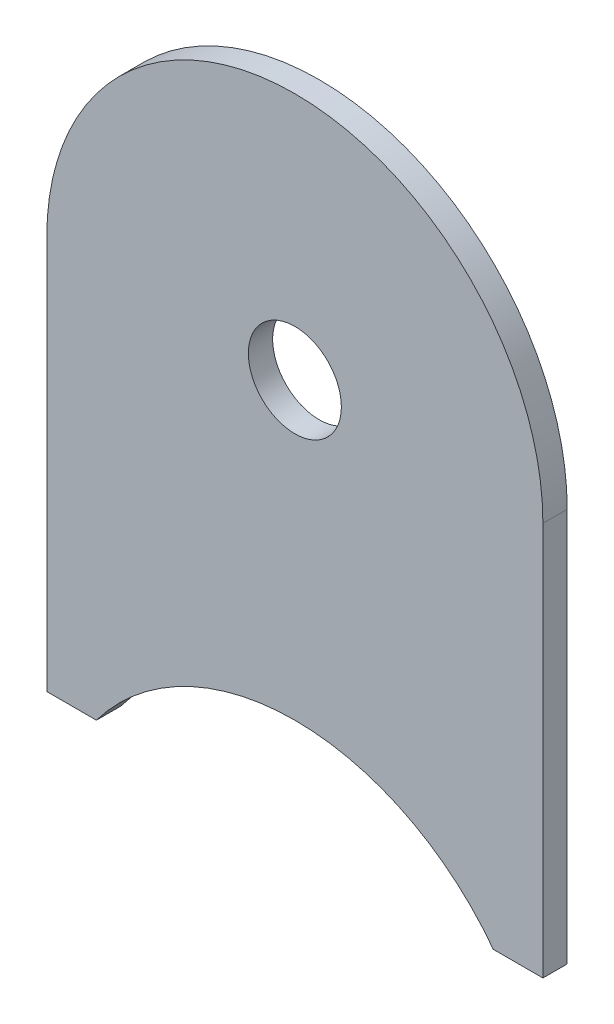
ISO-10303-21;
HEADER;
FILE_DESCRIPTION(('STEP AP214'),'2;1');
FILE_NAME('part.step','',(''),(''),'','','');
FILE_SCHEMA(('AUTOMOTIVE_DESIGN { 1 0 10303 214 1 1 1 1 }'));
ENDSEC;
DATA;
#1=APPLICATION_CONTEXT('core data for automotive mechanical design processes');
#2=APPLICATION_PROTOCOL_DEFINITION('international standard','automotive_design',2000,#1);
#3=PRODUCT_CONTEXT('',#1,'mechanical');
#4=PRODUCT('Part','Part','',(#3));
#5=PRODUCT_RELATED_PRODUCT_CATEGORY('part','',(#4));
#6=PRODUCT_DEFINITION_FORMATION('','',#4);
#7=PRODUCT_DEFINITION_CONTEXT('part definition',#1,'design');
#8=PRODUCT_DEFINITION('design','',#6,#7);
#9=PRODUCT_DEFINITION_SHAPE('','',#8);
#10=(LENGTH_UNIT() NAMED_UNIT(*) SI_UNIT(.MILLI.,.METRE.));
#11=(NAMED_UNIT(*) PLANE_ANGLE_UNIT() SI_UNIT($,.RADIAN.));
#12=(NAMED_UNIT(*) SI_UNIT($,.STERADIAN.) SOLID_ANGLE_UNIT());
#13=UNCERTAINTY_MEASURE_WITH_UNIT(LENGTH_MEASURE(1.E-05),#10,'distance_accuracy_value','');
#14=(GEOMETRIC_REPRESENTATION_CONTEXT(3) GLOBAL_UNCERTAINTY_ASSIGNED_CONTEXT((#13)) GLOBAL_UNIT_ASSIGNED_CONTEXT((#10,
#11,#12)) REPRESENTATION_CONTEXT('',''));
#15=CARTESIAN_POINT('',(0.,0.,0.));
#16=DIRECTION('',(0.,0.,1.));
#17=DIRECTION('',(1.,0.,0.));
#18=AXIS2_PLACEMENT_3D('',#15,#16,#17);
#19=CARTESIAN_POINT('',(12.7,20.16125,1.2446));
#20=DIRECTION('',(0.,0.,-1.));
#21=DIRECTION('',(-1.,0.,0.));
#22=AXIS2_PLACEMENT_3D('',#19,#20,#21);
#23=PLANE('',#22);
#24=DIRECTION('',(0.,-1.,0.));
#25=VECTOR('',#24,1.);
#26=CARTESIAN_POINT('',(0.,0.,1.2446));
#27=LINE('',#26,#25);
#28=CARTESIAN_POINT('',(0.,20.16125,1.2446));
#29=VERTEX_POINT('',#28);
#30=CARTESIAN_POINT('',(0.,0.,1.2446));
#31=VERTEX_POINT('',#30);
#32=EDGE_CURVE('E152',#29,#31,#27,.T.);
#33=ORIENTED_EDGE('',*,*,#32,.T.);
#34=DIRECTION('',(1.,0.,0.));
#35=VECTOR('',#34,1.);
#36=CARTESIAN_POINT('',(0.,0.,1.2446));
#37=LINE('',#36,#35);
#38=CARTESIAN_POINT('',(2.53999999999999,0.,1.2446));
#39=VERTEX_POINT('',#38);
#40=EDGE_CURVE('E100',#31,#39,#37,.T.);
#41=ORIENTED_EDGE('',*,*,#40,.T.);
#42=CARTESIAN_POINT('',(12.7,-7.62,1.2446));
#43=DIRECTION('',(0.,0.,-1.));
#44=DIRECTION('',(1.,0.,0.));
#45=AXIS2_PLACEMENT_3D('',#42,#43,#44);
#46=CIRCLE('',#45,12.7);
#47=CARTESIAN_POINT('',(22.86,0.,1.2446));
#48=VERTEX_POINT('',#47);
#49=EDGE_CURVE('E113',#39,#48,#46,.T.);
#50=ORIENTED_EDGE('',*,*,#49,.T.);
#51=DIRECTION('',(1.,0.,0.));
#52=VECTOR('',#51,1.);
#53=CARTESIAN_POINT('',(22.86,0.,1.2446));
#54=LINE('',#53,#52);
#55=CARTESIAN_POINT('',(25.4,0.,1.2446));
#56=VERTEX_POINT('',#55);
#57=EDGE_CURVE('E107',#48,#56,#54,.T.);
#58=ORIENTED_EDGE('',*,*,#57,.T.);
#59=DIRECTION('',(0.,1.,0.));
#60=VECTOR('',#59,1.);
#61=CARTESIAN_POINT('',(25.4,0.,1.2446));
#62=LINE('',#61,#60);
#63=CARTESIAN_POINT('',(25.4,20.16125,1.2446));
#64=VERTEX_POINT('',#63);
#65=EDGE_CURVE('E111',#56,#64,#62,.T.);
#66=ORIENTED_EDGE('',*,*,#65,.T.);
#67=CARTESIAN_POINT('',(12.7,20.16125,1.2446));
#68=DIRECTION('',(0.,0.,1.));
#69=DIRECTION('',(-1.,0.,0.));
#70=AXIS2_PLACEMENT_3D('',#67,#68,#69);
#71=CIRCLE('',#70,12.7);
#72=EDGE_CURVE('E63',#64,#29,#71,.T.);
#73=ORIENTED_EDGE('',*,*,#72,.T.);
#74=EDGE_LOOP('',(#33,#41,#50,#58,#66,#73));
#75=FACE_BOUND('',#74,.T.);
#76=CARTESIAN_POINT('',(12.7,20.16125,1.2446));
#77=DIRECTION('',(0.,0.,1.));
#78=DIRECTION('',(1.,0.,0.));
#79=AXIS2_PLACEMENT_3D('',#76,#77,#78);
#80=CIRCLE('',#79,2.38125);
#81=CARTESIAN_POINT('',(15.08125,20.16125,1.2446));
#82=VERTEX_POINT('',#81);
#83=EDGE_CURVE('E140',#82,#82,#80,.T.);
#84=ORIENTED_EDGE('',*,*,#83,.F.);
#85=EDGE_LOOP('',(#84));
#86=FACE_BOUND('',#85,.T.);
#87=ADVANCED_FACE('F45',(#75,#86),#23,.F.);
#88=CARTESIAN_POINT('',(12.7,20.16125,0.));
#89=DIRECTION('',(0.,0.,-1.));
#90=DIRECTION('',(-1.,0.,0.));
#91=AXIS2_PLACEMENT_3D('',#88,#89,#90);
#92=PLANE('',#91);
#93=DIRECTION('',(0.,-1.,0.));
#94=VECTOR('',#93,1.);
#95=CARTESIAN_POINT('',(0.,0.,0.));
#96=LINE('',#95,#94);
#97=CARTESIAN_POINT('',(0.,20.16125,0.));
#98=VERTEX_POINT('',#97);
#99=CARTESIAN_POINT('',(0.,0.,0.));
#100=VERTEX_POINT('',#99);
#101=EDGE_CURVE('E135',#98,#100,#96,.T.);
#102=ORIENTED_EDGE('',*,*,#101,.F.);
#103=CARTESIAN_POINT('',(12.7,20.16125,0.));
#104=DIRECTION('',(0.,0.,1.));
#105=DIRECTION('',(-1.,0.,0.));
#106=AXIS2_PLACEMENT_3D('',#103,#104,#105);
#107=CIRCLE('',#106,12.7);
#108=CARTESIAN_POINT('',(25.4,20.16125,0.));
#109=VERTEX_POINT('',#108);
#110=EDGE_CURVE('E92',#109,#98,#107,.T.);
#111=ORIENTED_EDGE('',*,*,#110,.F.);
#112=DIRECTION('',(0.,1.,0.));
#113=VECTOR('',#112,1.);
#114=CARTESIAN_POINT('',(25.4,0.,0.));
#115=LINE('',#114,#113);
#116=CARTESIAN_POINT('',(25.4,0.,0.));
#117=VERTEX_POINT('',#116);
#118=EDGE_CURVE('E86',#117,#109,#115,.T.);
#119=ORIENTED_EDGE('',*,*,#118,.F.);
#120=DIRECTION('',(1.,0.,0.));
#121=VECTOR('',#120,1.);
#122=CARTESIAN_POINT('',(22.86,0.,0.));
#123=LINE('',#122,#121);
#124=CARTESIAN_POINT('',(22.86,0.,0.));
#125=VERTEX_POINT('',#124);
#126=EDGE_CURVE('E122',#125,#117,#123,.T.);
#127=ORIENTED_EDGE('',*,*,#126,.F.);
#128=CARTESIAN_POINT('',(12.7,-7.62,0.));
#129=DIRECTION('',(0.,0.,-1.));
#130=DIRECTION('',(1.,0.,0.));
#131=AXIS2_PLACEMENT_3D('',#128,#129,#130);
#132=CIRCLE('',#131,12.7);
#133=CARTESIAN_POINT('',(2.53999999999999,0.,0.));
#134=VERTEX_POINT('',#133);
#135=EDGE_CURVE('E143',#134,#125,#132,.T.);
#136=ORIENTED_EDGE('',*,*,#135,.F.);
#137=DIRECTION('',(1.,0.,0.));
#138=VECTOR('',#137,1.);
#139=CARTESIAN_POINT('',(0.,0.,0.));
#140=LINE('',#139,#138);
#141=EDGE_CURVE('E139',#100,#134,#140,.T.);
#142=ORIENTED_EDGE('',*,*,#141,.F.);
#143=EDGE_LOOP('',(#102,#111,#119,#127,#136,#142));
#144=FACE_BOUND('',#143,.T.);
#145=CARTESIAN_POINT('',(12.7,20.16125,0.));
#146=DIRECTION('',(0.,0.,1.));
#147=DIRECTION('',(1.,0.,0.));
#148=AXIS2_PLACEMENT_3D('',#145,#146,#147);
#149=CIRCLE('',#148,2.38125);
#150=CARTESIAN_POINT('',(15.08125,20.16125,0.));
#151=VERTEX_POINT('',#150);
#152=EDGE_CURVE('E249',#151,#151,#149,.T.);
#153=ORIENTED_EDGE('',*,*,#152,.T.);
#154=EDGE_LOOP('',(#153));
#155=FACE_BOUND('',#154,.T.);
#156=ADVANCED_FACE('F165',(#144,#155),#92,.T.);
#157=CARTESIAN_POINT('',(0.,0.,1.2446));
#158=DIRECTION('',(1.,0.,0.));
#159=DIRECTION('',(0.,0.,-1.));
#160=AXIS2_PLACEMENT_3D('',#157,#158,#159);
#161=PLANE('',#160);
#162=ORIENTED_EDGE('',*,*,#101,.T.);
#163=DIRECTION('',(0.,0.,-1.));
#164=VECTOR('',#163,1.);
#165=CARTESIAN_POINT('',(0.,0.,1.2446));
#166=LINE('',#165,#164);
#167=EDGE_CURVE('E11',#31,#100,#166,.T.);
#168=ORIENTED_EDGE('',*,*,#167,.F.);
#169=ORIENTED_EDGE('',*,*,#32,.F.);
#170=DIRECTION('',(0.,0.,-1.));
#171=VECTOR('',#170,1.);
#172=CARTESIAN_POINT('',(0.,20.16125,1.2446));
#173=LINE('',#172,#171);
#174=EDGE_CURVE('E131',#29,#98,#173,.T.);
#175=ORIENTED_EDGE('',*,*,#174,.T.);
#176=EDGE_LOOP('',(#162,#168,#169,#175));
#177=FACE_BOUND('',#176,.T.);
#178=ADVANCED_FACE('F47',(#177),#161,.F.);
#179=CARTESIAN_POINT('',(0.,0.,1.2446));
#180=DIRECTION('',(0.,1.,0.));
#181=DIRECTION('',(0.,0.,1.));
#182=AXIS2_PLACEMENT_3D('',#179,#180,#181);
#183=PLANE('',#182);
#184=ORIENTED_EDGE('',*,*,#141,.T.);
#185=DIRECTION('',(0.,0.,-1.));
#186=VECTOR('',#185,1.);
#187=CARTESIAN_POINT('',(2.53999999999999,0.,1.2446));
#188=LINE('',#187,#186);
#189=EDGE_CURVE('E55',#39,#134,#188,.T.);
#190=ORIENTED_EDGE('',*,*,#189,.F.);
#191=ORIENTED_EDGE('',*,*,#40,.F.);
#192=ORIENTED_EDGE('',*,*,#167,.T.);
#193=EDGE_LOOP('',(#184,#190,#191,#192));
#194=FACE_BOUND('',#193,.T.);
#195=ADVANCED_FACE('F190',(#194),#183,.F.);
#196=CARTESIAN_POINT('',(12.7,-7.62,1.2446));
#197=DIRECTION('',(0.,0.,-1.));
#198=DIRECTION('',(-1.,0.,0.));
#199=AXIS2_PLACEMENT_3D('',#196,#197,#198);
#200=CYLINDRICAL_SURFACE('',#199,12.7);
#201=ORIENTED_EDGE('',*,*,#135,.T.);
#202=DIRECTION('',(0.,0.,-1.));
#203=VECTOR('',#202,1.);
#204=CARTESIAN_POINT('',(22.86,0.,1.2446));
#205=LINE('',#204,#203);
#206=EDGE_CURVE('E124',#48,#125,#205,.T.);
#207=ORIENTED_EDGE('',*,*,#206,.F.);
#208=ORIENTED_EDGE('',*,*,#49,.F.);
#209=ORIENTED_EDGE('',*,*,#189,.T.);
#210=EDGE_LOOP('',(#201,#207,#208,#209));
#211=FACE_BOUND('',#210,.T.);
#212=ADVANCED_FACE('F162',(#211),#200,.F.);
#213=CARTESIAN_POINT('',(22.86,0.,1.2446));
#214=DIRECTION('',(0.,1.,0.));
#215=DIRECTION('',(0.,0.,1.));
#216=AXIS2_PLACEMENT_3D('',#213,#214,#215);
#217=PLANE('',#216);
#218=ORIENTED_EDGE('',*,*,#126,.T.);
#219=DIRECTION('',(0.,0.,-1.));
#220=VECTOR('',#219,1.);
#221=CARTESIAN_POINT('',(25.4,0.,1.2446));
#222=LINE('',#221,#220);
#223=EDGE_CURVE('E119',#56,#117,#222,.T.);
#224=ORIENTED_EDGE('',*,*,#223,.F.);
#225=ORIENTED_EDGE('',*,*,#57,.F.);
#226=ORIENTED_EDGE('',*,*,#206,.T.);
#227=EDGE_LOOP('',(#218,#224,#225,#226));
#228=FACE_BOUND('',#227,.T.);
#229=ADVANCED_FACE('F120',(#228),#217,.F.);
#230=CARTESIAN_POINT('',(25.4,0.,1.2446));
#231=DIRECTION('',(-1.,0.,0.));
#232=DIRECTION('',(0.,0.,1.));
#233=AXIS2_PLACEMENT_3D('',#230,#231,#232);
#234=PLANE('',#233);
#235=ORIENTED_EDGE('',*,*,#118,.T.);
#236=DIRECTION('',(0.,0.,-1.));
#237=VECTOR('',#236,1.);
#238=CARTESIAN_POINT('',(25.4,20.16125,1.2446));
#239=LINE('',#238,#237);
#240=EDGE_CURVE('E125',#64,#109,#239,.T.);
#241=ORIENTED_EDGE('',*,*,#240,.F.);
#242=ORIENTED_EDGE('',*,*,#65,.F.);
#243=ORIENTED_EDGE('',*,*,#223,.T.);
#244=EDGE_LOOP('',(#235,#241,#242,#243));
#245=FACE_BOUND('',#244,.T.);
#246=ADVANCED_FACE('F127',(#245),#234,.F.);
#247=CARTESIAN_POINT('',(12.7,20.16125,1.2446));
#248=DIRECTION('',(0.,0.,-1.));
#249=DIRECTION('',(-1.,0.,0.));
#250=AXIS2_PLACEMENT_3D('',#247,#248,#249);
#251=CYLINDRICAL_SURFACE('',#250,12.7);
#252=ORIENTED_EDGE('',*,*,#110,.T.);
#253=ORIENTED_EDGE('',*,*,#174,.F.);
#254=ORIENTED_EDGE('',*,*,#72,.F.);
#255=ORIENTED_EDGE('',*,*,#240,.T.);
#256=EDGE_LOOP('',(#252,#253,#254,#255));
#257=FACE_BOUND('',#256,.T.);
#258=ADVANCED_FACE('F170',(#257),#251,.T.);
#259=CARTESIAN_POINT('',(12.7,20.16125,1.2446));
#260=DIRECTION('',(0.,0.,-1.));
#261=DIRECTION('',(-1.,0.,0.));
#262=AXIS2_PLACEMENT_3D('',#259,#260,#261);
#263=CYLINDRICAL_SURFACE('',#262,2.38125);
#264=ORIENTED_EDGE('',*,*,#83,.T.);
#265=EDGE_LOOP('',(#264));
#266=FACE_BOUND('',#265,.T.);
#267=ORIENTED_EDGE('',*,*,#152,.F.);
#268=EDGE_LOOP('',(#267));
#269=FACE_BOUND('',#268,.T.);
#270=ADVANCED_FACE('F172',(#266,#269),#263,.F.);
#271=CLOSED_SHELL('',(#87,#156,#178,#195,#212,#229,#246,#258,#270));
#272=MANIFOLD_SOLID_BREP('B2',#271);
#273=ADVANCED_BREP_SHAPE_REPRESENTATION('',(#18,#272),#14);
#274=SHAPE_DEFINITION_REPRESENTATION(#9,#273);
ENDSEC;
END-ISO-10303-21;
